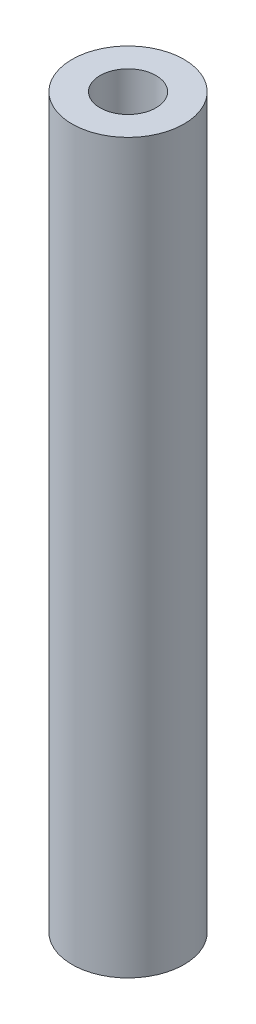
ISO-10303-21;
HEADER;
FILE_DESCRIPTION(('STEP AP214'),'2;1');
FILE_NAME('part.step','',(''),(''),'','','');
FILE_SCHEMA(('AUTOMOTIVE_DESIGN { 1 0 10303 214 1 1 1 1 }'));
ENDSEC;
DATA;
#1=APPLICATION_CONTEXT('core data for automotive mechanical design processes');
#2=APPLICATION_PROTOCOL_DEFINITION('international standard','automotive_design',2000,#1);
#3=PRODUCT_CONTEXT('',#1,'mechanical');
#4=PRODUCT('Part','Part','',(#3));
#5=PRODUCT_RELATED_PRODUCT_CATEGORY('part','',(#4));
#6=PRODUCT_DEFINITION_FORMATION('','',#4);
#7=PRODUCT_DEFINITION_CONTEXT('part definition',#1,'design');
#8=PRODUCT_DEFINITION('design','',#6,#7);
#9=PRODUCT_DEFINITION_SHAPE('','',#8);
#10=(LENGTH_UNIT() NAMED_UNIT(*) SI_UNIT(.MILLI.,.METRE.));
#11=(NAMED_UNIT(*) PLANE_ANGLE_UNIT() SI_UNIT($,.RADIAN.));
#12=(NAMED_UNIT(*) SI_UNIT($,.STERADIAN.) SOLID_ANGLE_UNIT());
#13=UNCERTAINTY_MEASURE_WITH_UNIT(LENGTH_MEASURE(1.E-05),#10,'distance_accuracy_value','');
#14=(GEOMETRIC_REPRESENTATION_CONTEXT(3) GLOBAL_UNCERTAINTY_ASSIGNED_CONTEXT((#13)) GLOBAL_UNIT_ASSIGNED_CONTEXT((#10,
#11,#12)) REPRESENTATION_CONTEXT('',''));
#15=CARTESIAN_POINT('',(0.,0.,0.));
#16=DIRECTION('',(0.,0.,1.));
#17=DIRECTION('',(1.,0.,0.));
#18=AXIS2_PLACEMENT_3D('',#15,#16,#17);
#19=CARTESIAN_POINT('',(0.,0.,0.));
#20=DIRECTION('',(0.,-1.,0.));
#21=DIRECTION('',(0.,0.,-1.));
#22=AXIS2_PLACEMENT_3D('',#19,#20,#21);
#23=CYLINDRICAL_SURFACE('',#22,5.);
#24=CARTESIAN_POINT('',(0.,65.,0.));
#25=DIRECTION('',(0.,-1.,0.));
#26=DIRECTION('',(0.,0.,-1.));
#27=AXIS2_PLACEMENT_3D('',#24,#25,#26);
#28=CIRCLE('',#27,5.);
#29=CARTESIAN_POINT('',(0.,65.,-5.));
#30=VERTEX_POINT('',#29);
#31=EDGE_CURVE('E37',#30,#30,#28,.T.);
#32=ORIENTED_EDGE('',*,*,#31,.T.);
#33=EDGE_LOOP('',(#32));
#34=FACE_BOUND('',#33,.T.);
#35=CARTESIAN_POINT('',(0.,0.,0.));
#36=DIRECTION('',(0.,-1.,0.));
#37=DIRECTION('',(0.,0.,-1.));
#38=AXIS2_PLACEMENT_3D('',#35,#36,#37);
#39=CIRCLE('',#38,5.);
#40=CARTESIAN_POINT('',(0.,0.,-5.));
#41=VERTEX_POINT('',#40);
#42=EDGE_CURVE('E10',#41,#41,#39,.T.);
#43=ORIENTED_EDGE('',*,*,#42,.F.);
#44=EDGE_LOOP('',(#43));
#45=FACE_BOUND('',#44,.T.);
#46=ADVANCED_FACE('F31',(#34,#45),#23,.T.);
#47=CARTESIAN_POINT('',(5.,0.,0.));
#48=DIRECTION('',(0.,1.,0.));
#49=DIRECTION('',(0.,0.,1.));
#50=AXIS2_PLACEMENT_3D('',#47,#48,#49);
#51=PLANE('',#50);
#52=CARTESIAN_POINT('',(0.,0.,0.));
#53=DIRECTION('',(0.,1.,0.));
#54=DIRECTION('',(0.,0.,1.));
#55=AXIS2_PLACEMENT_3D('',#52,#53,#54);
#56=CIRCLE('',#55,2.5);
#57=CARTESIAN_POINT('',(0.,0.,2.5));
#58=VERTEX_POINT('',#57);
#59=EDGE_CURVE('E41',#58,#58,#56,.T.);
#60=ORIENTED_EDGE('',*,*,#59,.T.);
#61=EDGE_LOOP('',(#60));
#62=FACE_BOUND('',#61,.T.);
#63=ORIENTED_EDGE('',*,*,#42,.T.);
#64=EDGE_LOOP('',(#63));
#65=FACE_BOUND('',#64,.T.);
#66=ADVANCED_FACE('F56',(#62,#65),#51,.F.);
#67=CARTESIAN_POINT('',(0.,65.,0.));
#68=DIRECTION('',(0.,-1.,0.));
#69=DIRECTION('',(0.,0.,-1.));
#70=AXIS2_PLACEMENT_3D('',#67,#68,#69);
#71=PLANE('',#70);
#72=CARTESIAN_POINT('',(0.,65.,0.));
#73=DIRECTION('',(0.,1.,0.));
#74=DIRECTION('',(0.,0.,1.));
#75=AXIS2_PLACEMENT_3D('',#72,#73,#74);
#76=CIRCLE('',#75,2.5);
#77=CARTESIAN_POINT('',(0.,65.,2.5));
#78=VERTEX_POINT('',#77);
#79=EDGE_CURVE('E45',#78,#78,#76,.T.);
#80=ORIENTED_EDGE('',*,*,#79,.F.);
#81=EDGE_LOOP('',(#80));
#82=FACE_BOUND('',#81,.T.);
#83=ORIENTED_EDGE('',*,*,#31,.F.);
#84=EDGE_LOOP('',(#83));
#85=FACE_BOUND('',#84,.T.);
#86=ADVANCED_FACE('F53',(#82,#85),#71,.F.);
#87=CARTESIAN_POINT('',(0.,0.,0.));
#88=DIRECTION('',(0.,1.,0.));
#89=DIRECTION('',(0.,0.,1.));
#90=AXIS2_PLACEMENT_3D('',#87,#88,#89);
#91=CYLINDRICAL_SURFACE('',#90,2.5);
#92=ORIENTED_EDGE('',*,*,#59,.F.);
#93=EDGE_LOOP('',(#92));
#94=FACE_BOUND('',#93,.T.);
#95=ORIENTED_EDGE('',*,*,#79,.T.);
#96=EDGE_LOOP('',(#95));
#97=FACE_BOUND('',#96,.T.);
#98=ADVANCED_FACE('F51',(#94,#97),#91,.F.);
#99=CLOSED_SHELL('',(#46,#66,#86,#98));
#100=MANIFOLD_SOLID_BREP('B2',#99);
#101=ADVANCED_BREP_SHAPE_REPRESENTATION('',(#18,#100),#14);
#102=SHAPE_DEFINITION_REPRESENTATION(#9,#101);
ENDSEC;
END-ISO-10303-21;
